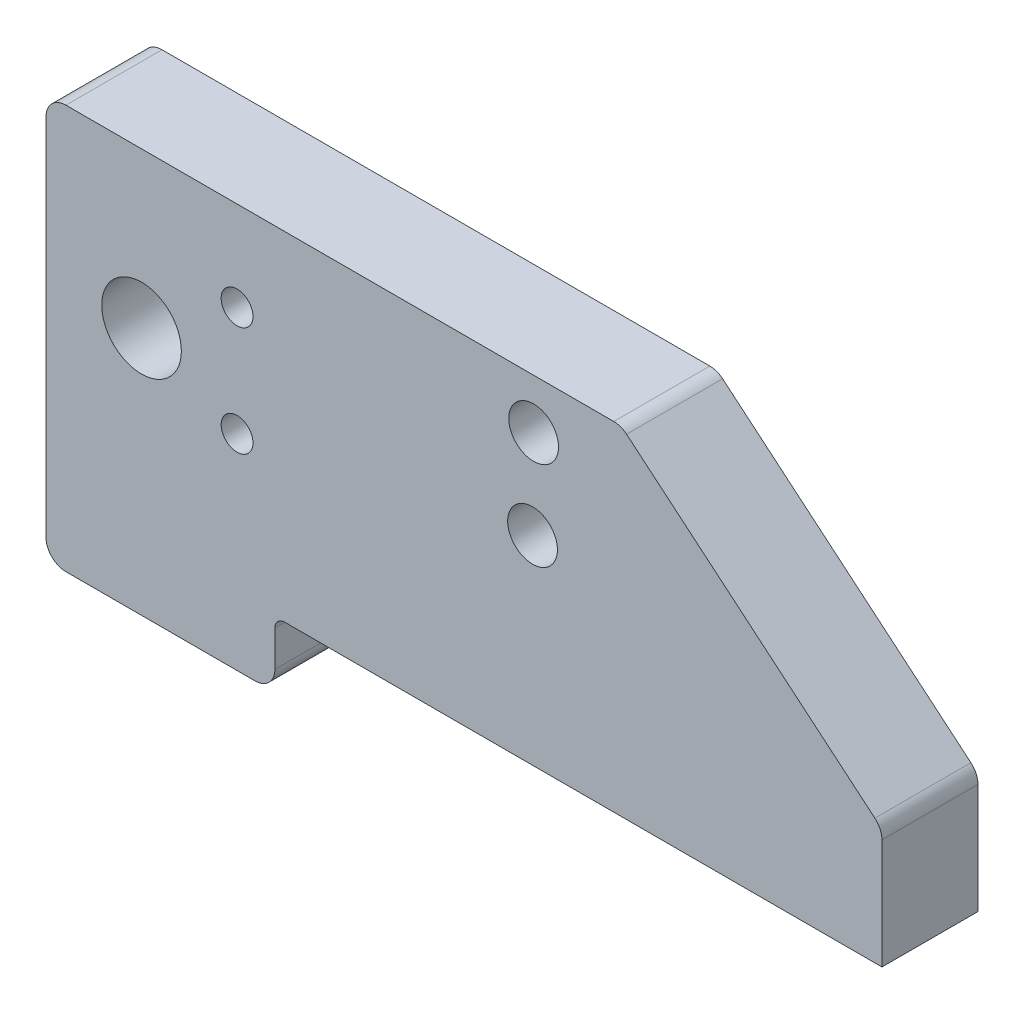
ISO-10303-21;
HEADER;
FILE_DESCRIPTION(('STEP AP214'),'2;1');
FILE_NAME('part.step','',(''),(''),'','','');
FILE_SCHEMA(('AUTOMOTIVE_DESIGN { 1 0 10303 214 1 1 1 1 }'));
ENDSEC;
DATA;
#1=APPLICATION_CONTEXT('core data for automotive mechanical design processes');
#2=APPLICATION_PROTOCOL_DEFINITION('international standard','automotive_design',2000,#1);
#3=PRODUCT_CONTEXT('',#1,'mechanical');
#4=PRODUCT('Part','Part','',(#3));
#5=PRODUCT_RELATED_PRODUCT_CATEGORY('part','',(#4));
#6=PRODUCT_DEFINITION_FORMATION('','',#4);
#7=PRODUCT_DEFINITION_CONTEXT('part definition',#1,'design');
#8=PRODUCT_DEFINITION('design','',#6,#7);
#9=PRODUCT_DEFINITION_SHAPE('','',#8);
#10=(LENGTH_UNIT() NAMED_UNIT(*) SI_UNIT(.MILLI.,.METRE.));
#11=(NAMED_UNIT(*) PLANE_ANGLE_UNIT() SI_UNIT($,.RADIAN.));
#12=(NAMED_UNIT(*) SI_UNIT($,.STERADIAN.) SOLID_ANGLE_UNIT());
#13=UNCERTAINTY_MEASURE_WITH_UNIT(LENGTH_MEASURE(1.E-05),#10,'distance_accuracy_value','');
#14=(GEOMETRIC_REPRESENTATION_CONTEXT(3) GLOBAL_UNCERTAINTY_ASSIGNED_CONTEXT((#13)) GLOBAL_UNIT_ASSIGNED_CONTEXT((#10,
#11,#12)) REPRESENTATION_CONTEXT('',''));
#15=CARTESIAN_POINT('',(0.,0.,0.));
#16=DIRECTION('',(0.,0.,1.));
#17=DIRECTION('',(1.,0.,0.));
#18=AXIS2_PLACEMENT_3D('',#15,#16,#17);
#19=CARTESIAN_POINT('',(0.,0.,4.826));
#20=DIRECTION('',(0.,-1.,0.));
#21=DIRECTION('',(0.,0.,-1.));
#22=AXIS2_PLACEMENT_3D('',#19,#20,#21);
#23=PLANE('',#22);
#24=CARTESIAN_POINT('',(-1.89071048146365,0.,2.413));
#25=DIRECTION('',(0.,-1.,0.));
#26=DIRECTION('',(0.,0.,-1.));
#27=AXIS2_PLACEMENT_3D('',#24,#25,#26);
#28=CIRCLE('',#27,1.24999999999999);
#29=CARTESIAN_POINT('',(-1.89071048146365,0.,1.16300000000001));
#30=VERTEX_POINT('',#29);
#31=EDGE_CURVE('E149',#30,#30,#28,.T.);
#32=ORIENTED_EDGE('',*,*,#31,.F.);
#33=EDGE_LOOP('',(#32));
#34=FACE_BOUND('',#33,.T.);
#35=CARTESIAN_POINT('',(10.1092895185364,0.,2.413));
#36=DIRECTION('',(0.,-1.,0.));
#37=DIRECTION('',(0.,0.,-1.));
#38=AXIS2_PLACEMENT_3D('',#35,#36,#37);
#39=CIRCLE('',#38,1.24999999999999);
#40=CARTESIAN_POINT('',(10.1092895185364,0.,1.16300000000001));
#41=VERTEX_POINT('',#40);
#42=EDGE_CURVE('E148',#41,#41,#39,.T.);
#43=ORIENTED_EDGE('',*,*,#42,.F.);
#44=EDGE_LOOP('',(#43));
#45=FACE_BOUND('',#44,.T.);
#46=DIRECTION('',(-1.,0.,0.));
#47=VECTOR('',#46,1.);
#48=CARTESIAN_POINT('',(0.,0.,4.826));
#49=LINE('',#48,#47);
#50=CARTESIAN_POINT('',(13.1092895185364,0.,4.826));
#51=VERTEX_POINT('',#50);
#52=CARTESIAN_POINT('',(-16.8907104814636,0.,4.826));
#53=VERTEX_POINT('',#52);
#54=EDGE_CURVE('E168',#51,#53,#49,.T.);
#55=ORIENTED_EDGE('',*,*,#54,.T.);
#56=DIRECTION('',(0.,0.,-1.));
#57=VECTOR('',#56,1.);
#58=CARTESIAN_POINT('',(-16.8907104814636,0.,0.));
#59=LINE('',#58,#57);
#60=CARTESIAN_POINT('',(-16.8907104814636,0.,0.));
#61=VERTEX_POINT('',#60);
#62=EDGE_CURVE('E237',#53,#61,#59,.T.);
#63=ORIENTED_EDGE('',*,*,#62,.T.);
#64=DIRECTION('',(-1.,0.,0.));
#65=VECTOR('',#64,1.);
#66=CARTESIAN_POINT('',(0.,0.,0.));
#67=LINE('',#66,#65);
#68=CARTESIAN_POINT('',(13.1092895185364,0.,0.));
#69=VERTEX_POINT('',#68);
#70=EDGE_CURVE('E167',#69,#61,#67,.T.);
#71=ORIENTED_EDGE('',*,*,#70,.F.);
#72=DIRECTION('',(0.,0.,-1.));
#73=VECTOR('',#72,1.);
#74=CARTESIAN_POINT('',(13.1092895185364,0.,4.826));
#75=LINE('',#74,#73);
#76=EDGE_CURVE('E180',#51,#69,#75,.T.);
#77=ORIENTED_EDGE('',*,*,#76,.F.);
#78=EDGE_LOOP('',(#55,#63,#71,#77));
#79=FACE_BOUND('',#78,.T.);
#80=ADVANCED_FACE('F41',(#34,#45,#79),#23,.T.);
#81=CARTESIAN_POINT('',(13.1092895185364,0.,4.826));
#82=DIRECTION('',(1.,0.,0.));
#83=DIRECTION('',(0.,0.,-1.));
#84=AXIS2_PLACEMENT_3D('',#81,#82,#83);
#85=PLANE('',#84);
#86=DIRECTION('',(0.,-1.,0.));
#87=VECTOR('',#86,1.);
#88=CARTESIAN_POINT('',(13.1092895185364,0.,0.));
#89=LINE('',#88,#87);
#90=CARTESIAN_POINT('',(13.1092895185364,5.533692341845,0.));
#91=VERTEX_POINT('',#90);
#92=EDGE_CURVE('E182',#91,#69,#89,.T.);
#93=ORIENTED_EDGE('',*,*,#92,.F.);
#94=DIRECTION('',(0.,0.,-1.));
#95=VECTOR('',#94,1.);
#96=CARTESIAN_POINT('',(13.1092895185364,5.533692341845,4.826));
#97=LINE('',#96,#95);
#98=CARTESIAN_POINT('',(13.1092895185364,5.533692341845,4.826));
#99=VERTEX_POINT('',#98);
#100=EDGE_CURVE('E206',#91,#99,#97,.F.);
#101=ORIENTED_EDGE('',*,*,#100,.T.);
#102=DIRECTION('',(0.,-1.,0.));
#103=VECTOR('',#102,1.);
#104=CARTESIAN_POINT('',(13.1092895185364,0.,4.826));
#105=LINE('',#104,#103);
#106=EDGE_CURVE('E171',#99,#51,#105,.T.);
#107=ORIENTED_EDGE('',*,*,#106,.T.);
#108=ORIENTED_EDGE('',*,*,#76,.T.);
#109=EDGE_LOOP('',(#93,#101,#107,#108));
#110=FACE_BOUND('',#109,.T.);
#111=ADVANCED_FACE('F252',(#110),#85,.T.);
#112=CARTESIAN_POINT('',(8.37086590060376,9.97600951016893,4.826));
#113=DIRECTION('',(0.642787609686538,0.766044443118979,0.));
#114=DIRECTION('',(-0.766044443118979,0.642787609686538,0.));
#115=AXIS2_PLACEMENT_3D('',#112,#113,#114);
#116=PLANE('',#115);
#117=DIRECTION('',(0.766044443118979,-0.642787609686538,0.));
#118=VECTOR('',#117,1.);
#119=CARTESIAN_POINT('',(8.37086590060376,9.97600951016893,4.826));
#120=LINE('',#119,#118);
#121=CARTESIAN_POINT('',(0.278817375420336,16.766044443119,4.826));
#122=VERTEX_POINT('',#121);
#123=CARTESIAN_POINT('',(12.7520771282229,6.29973678496398,4.826));
#124=VERTEX_POINT('',#123);
#125=EDGE_CURVE('E174',#122,#124,#120,.T.);
#126=ORIENTED_EDGE('',*,*,#125,.T.);
#127=DIRECTION('',(0.,0.,-1.));
#128=VECTOR('',#127,1.);
#129=CARTESIAN_POINT('',(12.7520771282229,6.29973678496398,4.826));
#130=LINE('',#129,#128);
#131=CARTESIAN_POINT('',(12.7520771282229,6.29973678496398,0.));
#132=VERTEX_POINT('',#131);
#133=EDGE_CURVE('E193',#124,#132,#130,.T.);
#134=ORIENTED_EDGE('',*,*,#133,.T.);
#135=DIRECTION('',(0.766044443118979,-0.642787609686538,0.));
#136=VECTOR('',#135,1.);
#137=CARTESIAN_POINT('',(8.37086590060376,9.97600951016893,0.));
#138=LINE('',#137,#136);
#139=CARTESIAN_POINT('',(0.278817375420336,16.766044443119,0.));
#140=VERTEX_POINT('',#139);
#141=EDGE_CURVE('E184',#140,#132,#138,.T.);
#142=ORIENTED_EDGE('',*,*,#141,.F.);
#143=DIRECTION('',(0.,0.,-1.));
#144=VECTOR('',#143,1.);
#145=CARTESIAN_POINT('',(0.278817375420336,16.766044443119,4.826));
#146=LINE('',#145,#144);
#147=EDGE_CURVE('E191',#140,#122,#146,.F.);
#148=ORIENTED_EDGE('',*,*,#147,.T.);
#149=EDGE_LOOP('',(#126,#134,#142,#148));
#150=FACE_BOUND('',#149,.T.);
#151=ADVANCED_FACE('F273',(#150),#116,.T.);
#152=CARTESIAN_POINT('',(0.,17.,4.826));
#153=DIRECTION('',(0.,-1.,0.));
#154=DIRECTION('',(0.,0.,-1.));
#155=AXIS2_PLACEMENT_3D('',#152,#153,#154);
#156=PLANE('',#155);
#157=DIRECTION('',(-1.,0.,0.));
#158=VECTOR('',#157,1.);
#159=CARTESIAN_POINT('',(0.,17.,4.826));
#160=LINE('',#159,#158);
#161=CARTESIAN_POINT('',(-0.363970234266202,17.,4.826));
#162=VERTEX_POINT('',#161);
#163=CARTESIAN_POINT('',(-27.8907104814636,17.,4.826));
#164=VERTEX_POINT('',#163);
#165=EDGE_CURVE('E177',#162,#164,#160,.T.);
#166=ORIENTED_EDGE('',*,*,#165,.F.);
#167=DIRECTION('',(0.,0.,-1.));
#168=VECTOR('',#167,1.);
#169=CARTESIAN_POINT('',(-0.363970234266202,17.,0.));
#170=LINE('',#169,#168);
#171=CARTESIAN_POINT('',(-0.363970234266202,17.,0.));
#172=VERTEX_POINT('',#171);
#173=EDGE_CURVE('E221',#162,#172,#170,.T.);
#174=ORIENTED_EDGE('',*,*,#173,.T.);
#175=DIRECTION('',(-1.,0.,0.));
#176=VECTOR('',#175,1.);
#177=CARTESIAN_POINT('',(0.,17.,0.));
#178=LINE('',#177,#176);
#179=CARTESIAN_POINT('',(-27.8907104814636,17.,0.));
#180=VERTEX_POINT('',#179);
#181=EDGE_CURVE('E172',#172,#180,#178,.T.);
#182=ORIENTED_EDGE('',*,*,#181,.T.);
#183=DIRECTION('',(0.,0.,-1.));
#184=VECTOR('',#183,1.);
#185=CARTESIAN_POINT('',(-27.8907104814636,17.,4.826));
#186=LINE('',#185,#184);
#187=EDGE_CURVE('E219',#180,#164,#186,.F.);
#188=ORIENTED_EDGE('',*,*,#187,.T.);
#189=EDGE_LOOP('',(#166,#174,#182,#188));
#190=FACE_BOUND('',#189,.T.);
#191=ADVANCED_FACE('F355',(#190),#156,.F.);
#192=CARTESIAN_POINT('',(0.,0.,4.826));
#193=DIRECTION('',(0.,0.,1.));
#194=DIRECTION('',(1.,0.,0.));
#195=AXIS2_PLACEMENT_3D('',#192,#193,#194);
#196=PLANE('',#195);
#197=CARTESIAN_POINT('',(-19.2907104814636,12.5,4.826));
#198=DIRECTION('',(0.,0.,1.));
#199=DIRECTION('',(1.,0.,0.));
#200=AXIS2_PLACEMENT_3D('',#197,#198,#199);
#201=CIRCLE('',#200,0.800000000000012);
#202=CARTESIAN_POINT('',(-18.4907104814636,12.5,4.826));
#203=VERTEX_POINT('',#202);
#204=EDGE_CURVE('E348',#203,#203,#201,.T.);
#205=ORIENTED_EDGE('',*,*,#204,.F.);
#206=EDGE_LOOP('',(#205));
#207=FACE_BOUND('',#206,.T.);
#208=CARTESIAN_POINT('',(-19.2907104814636,7.,4.826));
#209=DIRECTION('',(0.,0.,1.));
#210=DIRECTION('',(1.,0.,0.));
#211=AXIS2_PLACEMENT_3D('',#208,#209,#210);
#212=CIRCLE('',#211,0.800000000000012);
#213=CARTESIAN_POINT('',(-18.4907104814636,7.,4.826));
#214=VERTEX_POINT('',#213);
#215=EDGE_CURVE('E342',#214,#214,#212,.T.);
#216=ORIENTED_EDGE('',*,*,#215,.F.);
#217=EDGE_LOOP('',(#216));
#218=FACE_BOUND('',#217,.T.);
#219=CARTESIAN_POINT('',(-4.39071048146365,14.5,4.826));
#220=DIRECTION('',(0.,0.,1.));
#221=DIRECTION('',(1.,0.,0.));
#222=AXIS2_PLACEMENT_3D('',#219,#220,#221);
#223=CIRCLE('',#222,1.25);
#224=CARTESIAN_POINT('',(-3.14071048146365,14.5,4.826));
#225=VERTEX_POINT('',#224);
#226=EDGE_CURVE('E336',#225,#225,#223,.T.);
#227=ORIENTED_EDGE('',*,*,#226,.F.);
#228=EDGE_LOOP('',(#227));
#229=FACE_BOUND('',#228,.T.);
#230=CARTESIAN_POINT('',(-4.44535524073182,10.,4.826));
#231=DIRECTION('',(0.,0.,1.));
#232=DIRECTION('',(1.,0.,0.));
#233=AXIS2_PLACEMENT_3D('',#230,#231,#232);
#234=CIRCLE('',#233,1.24999999999999);
#235=CARTESIAN_POINT('',(-3.19535524073184,10.,4.826));
#236=VERTEX_POINT('',#235);
#237=EDGE_CURVE('E161',#236,#236,#234,.T.);
#238=ORIENTED_EDGE('',*,*,#237,.F.);
#239=EDGE_LOOP('',(#238));
#240=FACE_BOUND('',#239,.T.);
#241=ORIENTED_EDGE('',*,*,#106,.F.);
#242=CARTESIAN_POINT('',(12.1092895185364,5.533692341845,4.826));
#243=DIRECTION('',(0.,0.,1.));
#244=DIRECTION('',(1.,0.,0.));
#245=AXIS2_PLACEMENT_3D('',#242,#243,#244);
#246=CIRCLE('',#245,1.);
#247=EDGE_CURVE('E217',#99,#124,#246,.T.);
#248=ORIENTED_EDGE('',*,*,#247,.T.);
#249=ORIENTED_EDGE('',*,*,#125,.F.);
#250=CARTESIAN_POINT('',(-0.363970234266202,16.,4.826));
#251=DIRECTION('',(0.,0.,1.));
#252=DIRECTION('',(1.,0.,0.));
#253=AXIS2_PLACEMENT_3D('',#250,#251,#252);
#254=CIRCLE('',#253,1.);
#255=EDGE_CURVE('E215',#122,#162,#254,.T.);
#256=ORIENTED_EDGE('',*,*,#255,.T.);
#257=ORIENTED_EDGE('',*,*,#165,.T.);
#258=CARTESIAN_POINT('',(-27.8907104814636,16.,4.826));
#259=DIRECTION('',(0.,0.,1.));
#260=DIRECTION('',(1.,0.,0.));
#261=AXIS2_PLACEMENT_3D('',#258,#259,#260);
#262=CIRCLE('',#261,1.);
#263=CARTESIAN_POINT('',(-28.8907104814636,16.,4.826));
#264=VERTEX_POINT('',#263);
#265=EDGE_CURVE('E213',#164,#264,#262,.T.);
#266=ORIENTED_EDGE('',*,*,#265,.T.);
#267=DIRECTION('',(0.,1.,0.));
#268=VECTOR('',#267,1.);
#269=CARTESIAN_POINT('',(-28.8907104814636,0.,4.826));
#270=LINE('',#269,#268);
#271=CARTESIAN_POINT('',(-28.8907104814636,-2.3,4.826));
#272=VERTEX_POINT('',#271);
#273=EDGE_CURVE('E312',#272,#264,#270,.T.);
#274=ORIENTED_EDGE('',*,*,#273,.F.);
#275=CARTESIAN_POINT('',(-27.8907104814636,-2.3,4.826));
#276=DIRECTION('',(0.,0.,1.));
#277=DIRECTION('',(1.,0.,0.));
#278=AXIS2_PLACEMENT_3D('',#275,#276,#277);
#279=CIRCLE('',#278,1.);
#280=CARTESIAN_POINT('',(-27.8907104814636,-3.3,4.826));
#281=VERTEX_POINT('',#280);
#282=EDGE_CURVE('E208',#272,#281,#279,.T.);
#283=ORIENTED_EDGE('',*,*,#282,.T.);
#284=DIRECTION('',(-1.,0.,0.));
#285=VECTOR('',#284,1.);
#286=CARTESIAN_POINT('',(0.,-3.3,4.826));
#287=LINE('',#286,#285);
#288=CARTESIAN_POINT('',(-18.3907104814636,-3.3,4.826));
#289=VERTEX_POINT('',#288);
#290=EDGE_CURVE('E309',#289,#281,#287,.T.);
#291=ORIENTED_EDGE('',*,*,#290,.F.);
#292=CARTESIAN_POINT('',(-18.3907104814636,-2.3,4.826));
#293=DIRECTION('',(0.,0.,1.));
#294=DIRECTION('',(1.,0.,0.));
#295=AXIS2_PLACEMENT_3D('',#292,#293,#294);
#296=CIRCLE('',#295,1.);
#297=CARTESIAN_POINT('',(-17.3907104814636,-2.3,4.826));
#298=VERTEX_POINT('',#297);
#299=EDGE_CURVE('E210',#289,#298,#296,.T.);
#300=ORIENTED_EDGE('',*,*,#299,.T.);
#301=DIRECTION('',(0.,-1.,0.));
#302=VECTOR('',#301,1.);
#303=CARTESIAN_POINT('',(-17.3907104814636,0.,4.826));
#304=LINE('',#303,#302);
#305=CARTESIAN_POINT('',(-17.3907104814636,-0.499999999999999,4.826));
#306=VERTEX_POINT('',#305);
#307=EDGE_CURVE('E258',#306,#298,#304,.T.);
#308=ORIENTED_EDGE('',*,*,#307,.F.);
#309=CARTESIAN_POINT('',(-16.8907104814636,-0.5,4.826));
#310=DIRECTION('',(0.,0.,1.));
#311=DIRECTION('',(1.,0.,0.));
#312=AXIS2_PLACEMENT_3D('',#309,#310,#311);
#313=CIRCLE('',#312,0.5);
#314=EDGE_CURVE('E11',#306,#53,#313,.F.);
#315=ORIENTED_EDGE('',*,*,#314,.T.);
#316=ORIENTED_EDGE('',*,*,#54,.F.);
#317=EDGE_LOOP('',(#241,#248,#249,#256,#257,#266,#274,#283,#291,#300,#308,#315,#316));
#318=FACE_BOUND('',#317,.T.);
#319=CARTESIAN_POINT('',(-24.0907104814636,9.2,4.826));
#320=DIRECTION('',(0.,0.,1.));
#321=DIRECTION('',(1.,0.,0.));
#322=AXIS2_PLACEMENT_3D('',#319,#320,#321);
#323=CIRCLE('',#322,2.);
#324=CARTESIAN_POINT('',(-22.0907104814636,9.2,4.826));
#325=VERTEX_POINT('',#324);
#326=EDGE_CURVE('E319',#325,#325,#323,.T.);
#327=ORIENTED_EDGE('',*,*,#326,.F.);
#328=EDGE_LOOP('',(#327));
#329=FACE_BOUND('',#328,.T.);
#330=ADVANCED_FACE('F255',(#207,#218,#229,#240,#318,#329),#196,.T.);
#331=CARTESIAN_POINT('',(0.,0.,0.));
#332=DIRECTION('',(0.,0.,1.));
#333=DIRECTION('',(1.,0.,0.));
#334=AXIS2_PLACEMENT_3D('',#331,#332,#333);
#335=PLANE('',#334);
#336=CARTESIAN_POINT('',(-19.2907104814636,12.5,0.));
#337=DIRECTION('',(0.,0.,1.));
#338=DIRECTION('',(1.,0.,0.));
#339=AXIS2_PLACEMENT_3D('',#336,#337,#338);
#340=CIRCLE('',#339,0.800000000000012);
#341=CARTESIAN_POINT('',(-18.4907104814636,12.5,0.));
#342=VERTEX_POINT('',#341);
#343=EDGE_CURVE('E345',#342,#342,#340,.T.);
#344=ORIENTED_EDGE('',*,*,#343,.T.);
#345=EDGE_LOOP('',(#344));
#346=FACE_BOUND('',#345,.T.);
#347=CARTESIAN_POINT('',(-19.2907104814636,7.,0.));
#348=DIRECTION('',(0.,0.,1.));
#349=DIRECTION('',(1.,0.,0.));
#350=AXIS2_PLACEMENT_3D('',#347,#348,#349);
#351=CIRCLE('',#350,0.800000000000012);
#352=CARTESIAN_POINT('',(-18.4907104814636,7.,0.));
#353=VERTEX_POINT('',#352);
#354=EDGE_CURVE('E339',#353,#353,#351,.T.);
#355=ORIENTED_EDGE('',*,*,#354,.T.);
#356=EDGE_LOOP('',(#355));
#357=FACE_BOUND('',#356,.T.);
#358=CARTESIAN_POINT('',(-4.39071048146365,14.5,0.));
#359=DIRECTION('',(0.,0.,1.));
#360=DIRECTION('',(1.,0.,0.));
#361=AXIS2_PLACEMENT_3D('',#358,#359,#360);
#362=CIRCLE('',#361,1.25);
#363=CARTESIAN_POINT('',(-3.14071048146365,14.5,0.));
#364=VERTEX_POINT('',#363);
#365=EDGE_CURVE('E321',#364,#364,#362,.T.);
#366=ORIENTED_EDGE('',*,*,#365,.T.);
#367=EDGE_LOOP('',(#366));
#368=FACE_BOUND('',#367,.T.);
#369=CARTESIAN_POINT('',(-4.44535524073182,10.,0.));
#370=DIRECTION('',(0.,0.,1.));
#371=DIRECTION('',(1.,0.,0.));
#372=AXIS2_PLACEMENT_3D('',#369,#370,#371);
#373=CIRCLE('',#372,1.25);
#374=CARTESIAN_POINT('',(-3.19535524073183,10.,0.));
#375=VERTEX_POINT('',#374);
#376=EDGE_CURVE('E164',#375,#375,#373,.T.);
#377=ORIENTED_EDGE('',*,*,#376,.T.);
#378=EDGE_LOOP('',(#377));
#379=FACE_BOUND('',#378,.T.);
#380=ORIENTED_EDGE('',*,*,#141,.T.);
#381=CARTESIAN_POINT('',(12.1092895185364,5.533692341845,0.));
#382=DIRECTION('',(0.,0.,1.));
#383=DIRECTION('',(1.,0.,0.));
#384=AXIS2_PLACEMENT_3D('',#381,#382,#383);
#385=CIRCLE('',#384,1.);
#386=EDGE_CURVE('E204',#132,#91,#385,.F.);
#387=ORIENTED_EDGE('',*,*,#386,.T.);
#388=ORIENTED_EDGE('',*,*,#92,.T.);
#389=ORIENTED_EDGE('',*,*,#70,.T.);
#390=CARTESIAN_POINT('',(-16.8907104814636,-0.5,0.));
#391=DIRECTION('',(0.,0.,1.));
#392=DIRECTION('',(1.,0.,0.));
#393=AXIS2_PLACEMENT_3D('',#390,#391,#392);
#394=CIRCLE('',#393,0.5);
#395=CARTESIAN_POINT('',(-17.3907104814636,-0.499999999999999,0.));
#396=VERTEX_POINT('',#395);
#397=EDGE_CURVE('E49',#61,#396,#394,.T.);
#398=ORIENTED_EDGE('',*,*,#397,.T.);
#399=DIRECTION('',(0.,-1.,0.));
#400=VECTOR('',#399,1.);
#401=CARTESIAN_POINT('',(-17.3907104814636,0.,0.));
#402=LINE('',#401,#400);
#403=CARTESIAN_POINT('',(-17.3907104814636,-2.3,0.));
#404=VERTEX_POINT('',#403);
#405=EDGE_CURVE('E328',#396,#404,#402,.T.);
#406=ORIENTED_EDGE('',*,*,#405,.T.);
#407=CARTESIAN_POINT('',(-18.3907104814636,-2.3,0.));
#408=DIRECTION('',(0.,0.,1.));
#409=DIRECTION('',(1.,0.,0.));
#410=AXIS2_PLACEMENT_3D('',#407,#408,#409);
#411=CIRCLE('',#410,1.);
#412=CARTESIAN_POINT('',(-18.3907104814636,-3.3,0.));
#413=VERTEX_POINT('',#412);
#414=EDGE_CURVE('E198',#404,#413,#411,.F.);
#415=ORIENTED_EDGE('',*,*,#414,.T.);
#416=DIRECTION('',(-1.,0.,0.));
#417=VECTOR('',#416,1.);
#418=CARTESIAN_POINT('',(0.,-3.3,0.));
#419=LINE('',#418,#417);
#420=CARTESIAN_POINT('',(-27.8907104814636,-3.3,0.));
#421=VERTEX_POINT('',#420);
#422=EDGE_CURVE('E331',#413,#421,#419,.T.);
#423=ORIENTED_EDGE('',*,*,#422,.T.);
#424=CARTESIAN_POINT('',(-27.8907104814636,-2.3,0.));
#425=DIRECTION('',(0.,0.,1.));
#426=DIRECTION('',(1.,0.,0.));
#427=AXIS2_PLACEMENT_3D('',#424,#425,#426);
#428=CIRCLE('',#427,1.);
#429=CARTESIAN_POINT('',(-28.8907104814636,-2.3,0.));
#430=VERTEX_POINT('',#429);
#431=EDGE_CURVE('E196',#421,#430,#428,.F.);
#432=ORIENTED_EDGE('',*,*,#431,.T.);
#433=DIRECTION('',(0.,1.,0.));
#434=VECTOR('',#433,1.);
#435=CARTESIAN_POINT('',(-28.8907104814636,0.,0.));
#436=LINE('',#435,#434);
#437=CARTESIAN_POINT('',(-28.8907104814636,16.,0.));
#438=VERTEX_POINT('',#437);
#439=EDGE_CURVE('E155',#430,#438,#436,.T.);
#440=ORIENTED_EDGE('',*,*,#439,.T.);
#441=CARTESIAN_POINT('',(-27.8907104814636,16.,0.));
#442=DIRECTION('',(0.,0.,1.));
#443=DIRECTION('',(1.,0.,0.));
#444=AXIS2_PLACEMENT_3D('',#441,#442,#443);
#445=CIRCLE('',#444,1.);
#446=EDGE_CURVE('E200',#438,#180,#445,.F.);
#447=ORIENTED_EDGE('',*,*,#446,.T.);
#448=ORIENTED_EDGE('',*,*,#181,.F.);
#449=CARTESIAN_POINT('',(-0.363970234266202,16.,0.));
#450=DIRECTION('',(0.,0.,1.));
#451=DIRECTION('',(1.,0.,0.));
#452=AXIS2_PLACEMENT_3D('',#449,#450,#451);
#453=CIRCLE('',#452,1.);
#454=EDGE_CURVE('E202',#172,#140,#453,.F.);
#455=ORIENTED_EDGE('',*,*,#454,.T.);
#456=EDGE_LOOP('',(#380,#387,#388,#389,#398,#406,#415,#423,#432,#440,#447,#448,#455));
#457=FACE_BOUND('',#456,.T.);
#458=CARTESIAN_POINT('',(-24.0907104814636,9.2,0.));
#459=DIRECTION('',(0.,0.,1.));
#460=DIRECTION('',(1.,0.,0.));
#461=AXIS2_PLACEMENT_3D('',#458,#459,#460);
#462=CIRCLE('',#461,2.);
#463=CARTESIAN_POINT('',(-22.0907104814636,9.2,0.));
#464=VERTEX_POINT('',#463);
#465=EDGE_CURVE('E325',#464,#464,#462,.T.);
#466=ORIENTED_EDGE('',*,*,#465,.T.);
#467=EDGE_LOOP('',(#466));
#468=FACE_BOUND('',#467,.T.);
#469=ADVANCED_FACE('F247',(#346,#357,#368,#379,#457,#468),#335,.F.);
#470=CARTESIAN_POINT('',(-4.44535524073182,10.,4.826));
#471=DIRECTION('',(0.,0.,1.));
#472=DIRECTION('',(1.,0.,0.));
#473=AXIS2_PLACEMENT_3D('',#470,#471,#472);
#474=CYLINDRICAL_SURFACE('',#473,1.24999999999999);
#475=ORIENTED_EDGE('',*,*,#376,.F.);
#476=EDGE_LOOP('',(#475));
#477=FACE_BOUND('',#476,.T.);
#478=ORIENTED_EDGE('',*,*,#237,.T.);
#479=EDGE_LOOP('',(#478));
#480=FACE_BOUND('',#479,.T.);
#481=ADVANCED_FACE('F363',(#477,#480),#474,.F.);
#482=CARTESIAN_POINT('',(10.1092895185364,5.,2.413));
#483=DIRECTION('',(0.,-1.,0.));
#484=DIRECTION('',(0.,0.,-1.));
#485=AXIS2_PLACEMENT_3D('',#482,#483,#484);
#486=CONICAL_SURFACE('',#485,1.25,1.02974425867665);
#487=CARTESIAN_POINT('',(10.1092895185364,5.75107577378445,2.413));
#488=VERTEX_POINT('',#487);
#489=VERTEX_LOOP('',#488);
#490=FACE_BOUND('',#489,.T.);
#491=CARTESIAN_POINT('',(10.1092895185364,5.,2.413));
#492=DIRECTION('',(0.,-1.,0.));
#493=DIRECTION('',(0.,0.,-1.));
#494=AXIS2_PLACEMENT_3D('',#491,#492,#493);
#495=CIRCLE('',#494,1.25);
#496=CARTESIAN_POINT('',(10.1092895185364,5.,1.163));
#497=VERTEX_POINT('',#496);
#498=EDGE_CURVE('E152',#497,#497,#495,.T.);
#499=ORIENTED_EDGE('',*,*,#498,.T.);
#500=EDGE_LOOP('',(#499));
#501=FACE_BOUND('',#500,.T.);
#502=ADVANCED_FACE('F365',(#490,#501),#486,.F.);
#503=CARTESIAN_POINT('',(10.1092895185364,0.,2.413));
#504=DIRECTION('',(0.,-1.,0.));
#505=DIRECTION('',(0.,0.,-1.));
#506=AXIS2_PLACEMENT_3D('',#503,#504,#505);
#507=CYLINDRICAL_SURFACE('',#506,1.24999999999999);
#508=ORIENTED_EDGE('',*,*,#498,.F.);
#509=EDGE_LOOP('',(#508));
#510=FACE_BOUND('',#509,.T.);
#511=ORIENTED_EDGE('',*,*,#42,.T.);
#512=EDGE_LOOP('',(#511));
#513=FACE_BOUND('',#512,.T.);
#514=ADVANCED_FACE('F142',(#510,#513),#507,.F.);
#515=CARTESIAN_POINT('',(-1.89071048146365,5.,2.413));
#516=DIRECTION('',(0.,-1.,0.));
#517=DIRECTION('',(0.,0.,-1.));
#518=AXIS2_PLACEMENT_3D('',#515,#516,#517);
#519=CONICAL_SURFACE('',#518,1.25,1.02974425867665);
#520=CARTESIAN_POINT('',(-1.89071048146365,5.75107577378445,2.413));
#521=VERTEX_POINT('',#520);
#522=VERTEX_LOOP('',#521);
#523=FACE_BOUND('',#522,.T.);
#524=CARTESIAN_POINT('',(-1.89071048146365,5.,2.413));
#525=DIRECTION('',(0.,-1.,0.));
#526=DIRECTION('',(0.,0.,-1.));
#527=AXIS2_PLACEMENT_3D('',#524,#525,#526);
#528=CIRCLE('',#527,1.25);
#529=CARTESIAN_POINT('',(-1.89071048146365,5.,1.163));
#530=VERTEX_POINT('',#529);
#531=EDGE_CURVE('E146',#530,#530,#528,.T.);
#532=ORIENTED_EDGE('',*,*,#531,.T.);
#533=EDGE_LOOP('',(#532));
#534=FACE_BOUND('',#533,.T.);
#535=ADVANCED_FACE('F138',(#523,#534),#519,.F.);
#536=CARTESIAN_POINT('',(-1.89071048146365,0.,2.413));
#537=DIRECTION('',(0.,-1.,0.));
#538=DIRECTION('',(0.,0.,-1.));
#539=AXIS2_PLACEMENT_3D('',#536,#537,#538);
#540=CYLINDRICAL_SURFACE('',#539,1.24999999999999);
#541=ORIENTED_EDGE('',*,*,#531,.F.);
#542=EDGE_LOOP('',(#541));
#543=FACE_BOUND('',#542,.T.);
#544=ORIENTED_EDGE('',*,*,#31,.T.);
#545=EDGE_LOOP('',(#544));
#546=FACE_BOUND('',#545,.T.);
#547=ADVANCED_FACE('F141',(#543,#546),#540,.F.);
#548=CARTESIAN_POINT('',(-28.8907104814636,0.,33.3231928442084));
#549=DIRECTION('',(-1.,0.,0.));
#550=DIRECTION('',(0.,-1.,0.));
#551=AXIS2_PLACEMENT_3D('',#548,#549,#550);
#552=PLANE('',#551);
#553=ORIENTED_EDGE('',*,*,#273,.T.);
#554=DIRECTION('',(0.,0.,-1.));
#555=VECTOR('',#554,1.);
#556=CARTESIAN_POINT('',(-28.8907104814636,16.,0.));
#557=LINE('',#556,#555);
#558=EDGE_CURVE('E226',#264,#438,#557,.T.);
#559=ORIENTED_EDGE('',*,*,#558,.T.);
#560=ORIENTED_EDGE('',*,*,#439,.F.);
#561=DIRECTION('',(0.,0.,-1.));
#562=VECTOR('',#561,1.);
#563=CARTESIAN_POINT('',(-28.8907104814636,-2.3,33.3231928442084));
#564=LINE('',#563,#562);
#565=EDGE_CURVE('E224',#430,#272,#564,.F.);
#566=ORIENTED_EDGE('',*,*,#565,.T.);
#567=EDGE_LOOP('',(#553,#559,#560,#566));
#568=FACE_BOUND('',#567,.T.);
#569=ADVANCED_FACE('F398',(#568),#552,.T.);
#570=CARTESIAN_POINT('',(0.,-3.3,33.3231928442084));
#571=DIRECTION('',(0.,-1.,0.));
#572=DIRECTION('',(1.,0.,0.));
#573=AXIS2_PLACEMENT_3D('',#570,#571,#572);
#574=PLANE('',#573);
#575=ORIENTED_EDGE('',*,*,#422,.F.);
#576=DIRECTION('',(0.,0.,-1.));
#577=VECTOR('',#576,1.);
#578=CARTESIAN_POINT('',(-18.3907104814636,-3.3,33.3231928442084));
#579=LINE('',#578,#577);
#580=EDGE_CURVE('E235',#413,#289,#579,.F.);
#581=ORIENTED_EDGE('',*,*,#580,.T.);
#582=ORIENTED_EDGE('',*,*,#290,.T.);
#583=DIRECTION('',(0.,0.,-1.));
#584=VECTOR('',#583,1.);
#585=CARTESIAN_POINT('',(-27.8907104814636,-3.3,33.3231928442084));
#586=LINE('',#585,#584);
#587=EDGE_CURVE('E232',#281,#421,#586,.T.);
#588=ORIENTED_EDGE('',*,*,#587,.T.);
#589=EDGE_LOOP('',(#575,#581,#582,#588));
#590=FACE_BOUND('',#589,.T.);
#591=ADVANCED_FACE('F315',(#590),#574,.T.);
#592=CARTESIAN_POINT('',(-17.3907104814636,0.,33.3231928442084));
#593=DIRECTION('',(1.,0.,0.));
#594=DIRECTION('',(0.,1.,0.));
#595=AXIS2_PLACEMENT_3D('',#592,#593,#594);
#596=PLANE('',#595);
#597=ORIENTED_EDGE('',*,*,#405,.F.);
#598=DIRECTION('',(0.,0.,-1.));
#599=VECTOR('',#598,1.);
#600=CARTESIAN_POINT('',(-17.3907104814636,-0.499999999999999,4.826));
#601=LINE('',#600,#599);
#602=EDGE_CURVE('E62',#396,#306,#601,.F.);
#603=ORIENTED_EDGE('',*,*,#602,.T.);
#604=ORIENTED_EDGE('',*,*,#307,.T.);
#605=DIRECTION('',(0.,0.,-1.));
#606=VECTOR('',#605,1.);
#607=CARTESIAN_POINT('',(-17.3907104814636,-2.3,33.3231928442084));
#608=LINE('',#607,#606);
#609=EDGE_CURVE('E229',#298,#404,#608,.T.);
#610=ORIENTED_EDGE('',*,*,#609,.T.);
#611=EDGE_LOOP('',(#597,#603,#604,#610));
#612=FACE_BOUND('',#611,.T.);
#613=ADVANCED_FACE('F405',(#612),#596,.T.);
#614=CARTESIAN_POINT('',(-24.0907104814636,9.2,33.3231928442084));
#615=DIRECTION('',(0.,0.,-1.));
#616=DIRECTION('',(-1.,0.,0.));
#617=AXIS2_PLACEMENT_3D('',#614,#615,#616);
#618=CYLINDRICAL_SURFACE('',#617,2.);
#619=ORIENTED_EDGE('',*,*,#465,.F.);
#620=EDGE_LOOP('',(#619));
#621=FACE_BOUND('',#620,.T.);
#622=ORIENTED_EDGE('',*,*,#326,.T.);
#623=EDGE_LOOP('',(#622));
#624=FACE_BOUND('',#623,.T.);
#625=ADVANCED_FACE('F433',(#621,#624),#618,.F.);
#626=CARTESIAN_POINT('',(-4.39071048146365,14.5,4.826));
#627=DIRECTION('',(0.,0.,1.));
#628=DIRECTION('',(1.,0.,0.));
#629=AXIS2_PLACEMENT_3D('',#626,#627,#628);
#630=CYLINDRICAL_SURFACE('',#629,1.25);
#631=ORIENTED_EDGE('',*,*,#365,.F.);
#632=EDGE_LOOP('',(#631));
#633=FACE_BOUND('',#632,.T.);
#634=ORIENTED_EDGE('',*,*,#226,.T.);
#635=EDGE_LOOP('',(#634));
#636=FACE_BOUND('',#635,.T.);
#637=ADVANCED_FACE('F283',(#633,#636),#630,.F.);
#638=CARTESIAN_POINT('',(12.1092895185364,5.533692341845,4.826));
#639=DIRECTION('',(0.,0.,-1.));
#640=DIRECTION('',(-1.,0.,0.));
#641=AXIS2_PLACEMENT_3D('',#638,#639,#640);
#642=CYLINDRICAL_SURFACE('',#641,1.);
#643=ORIENTED_EDGE('',*,*,#247,.F.);
#644=ORIENTED_EDGE('',*,*,#100,.F.);
#645=ORIENTED_EDGE('',*,*,#386,.F.);
#646=ORIENTED_EDGE('',*,*,#133,.F.);
#647=EDGE_LOOP('',(#643,#644,#645,#646));
#648=FACE_BOUND('',#647,.T.);
#649=ADVANCED_FACE('F279',(#648),#642,.T.);
#650=CARTESIAN_POINT('',(-0.363970234266202,16.,4.826));
#651=DIRECTION('',(0.,0.,1.));
#652=DIRECTION('',(1.,0.,0.));
#653=AXIS2_PLACEMENT_3D('',#650,#651,#652);
#654=CYLINDRICAL_SURFACE('',#653,1.);
#655=ORIENTED_EDGE('',*,*,#255,.F.);
#656=ORIENTED_EDGE('',*,*,#147,.F.);
#657=ORIENTED_EDGE('',*,*,#454,.F.);
#658=ORIENTED_EDGE('',*,*,#173,.F.);
#659=EDGE_LOOP('',(#655,#656,#657,#658));
#660=FACE_BOUND('',#659,.T.);
#661=ADVANCED_FACE('F282',(#660),#654,.T.);
#662=CARTESIAN_POINT('',(-27.8907104814636,16.,33.3231928442084));
#663=DIRECTION('',(0.,0.,1.));
#664=DIRECTION('',(1.,0.,0.));
#665=AXIS2_PLACEMENT_3D('',#662,#663,#664);
#666=CYLINDRICAL_SURFACE('',#665,1.);
#667=ORIENTED_EDGE('',*,*,#265,.F.);
#668=ORIENTED_EDGE('',*,*,#187,.F.);
#669=ORIENTED_EDGE('',*,*,#446,.F.);
#670=ORIENTED_EDGE('',*,*,#558,.F.);
#671=EDGE_LOOP('',(#667,#668,#669,#670));
#672=FACE_BOUND('',#671,.T.);
#673=ADVANCED_FACE('F287',(#672),#666,.T.);
#674=CARTESIAN_POINT('',(-18.3907104814636,-2.3,33.3231928442084));
#675=DIRECTION('',(0.,0.,-1.));
#676=DIRECTION('',(-1.,0.,0.));
#677=AXIS2_PLACEMENT_3D('',#674,#675,#676);
#678=CYLINDRICAL_SURFACE('',#677,1.);
#679=ORIENTED_EDGE('',*,*,#299,.F.);
#680=ORIENTED_EDGE('',*,*,#580,.F.);
#681=ORIENTED_EDGE('',*,*,#414,.F.);
#682=ORIENTED_EDGE('',*,*,#609,.F.);
#683=EDGE_LOOP('',(#679,#680,#681,#682));
#684=FACE_BOUND('',#683,.T.);
#685=ADVANCED_FACE('F291',(#684),#678,.T.);
#686=CARTESIAN_POINT('',(-27.8907104814636,-2.3,33.3231928442084));
#687=DIRECTION('',(0.,0.,-1.));
#688=DIRECTION('',(-1.,0.,0.));
#689=AXIS2_PLACEMENT_3D('',#686,#687,#688);
#690=CYLINDRICAL_SURFACE('',#689,1.);
#691=ORIENTED_EDGE('',*,*,#282,.F.);
#692=ORIENTED_EDGE('',*,*,#565,.F.);
#693=ORIENTED_EDGE('',*,*,#431,.F.);
#694=ORIENTED_EDGE('',*,*,#587,.F.);
#695=EDGE_LOOP('',(#691,#692,#693,#694));
#696=FACE_BOUND('',#695,.T.);
#697=ADVANCED_FACE('F294',(#696),#690,.T.);
#698=CARTESIAN_POINT('',(-19.2907104814636,7.,4.826));
#699=DIRECTION('',(0.,0.,1.));
#700=DIRECTION('',(1.,0.,0.));
#701=AXIS2_PLACEMENT_3D('',#698,#699,#700);
#702=CYLINDRICAL_SURFACE('',#701,0.800000000000012);
#703=ORIENTED_EDGE('',*,*,#354,.F.);
#704=EDGE_LOOP('',(#703));
#705=FACE_BOUND('',#704,.T.);
#706=ORIENTED_EDGE('',*,*,#215,.T.);
#707=EDGE_LOOP('',(#706));
#708=FACE_BOUND('',#707,.T.);
#709=ADVANCED_FACE('F264',(#705,#708),#702,.F.);
#710=CARTESIAN_POINT('',(-19.2907104814636,12.5,4.826));
#711=DIRECTION('',(0.,0.,1.));
#712=DIRECTION('',(1.,0.,0.));
#713=AXIS2_PLACEMENT_3D('',#710,#711,#712);
#714=CYLINDRICAL_SURFACE('',#713,0.800000000000012);
#715=ORIENTED_EDGE('',*,*,#343,.F.);
#716=EDGE_LOOP('',(#715));
#717=FACE_BOUND('',#716,.T.);
#718=ORIENTED_EDGE('',*,*,#204,.T.);
#719=EDGE_LOOP('',(#718));
#720=FACE_BOUND('',#719,.T.);
#721=ADVANCED_FACE('F260',(#717,#720),#714,.F.);
#722=CARTESIAN_POINT('',(-16.8907104814636,-0.5,4.826));
#723=DIRECTION('',(0.,0.,1.));
#724=DIRECTION('',(1.,0.,0.));
#725=AXIS2_PLACEMENT_3D('',#722,#723,#724);
#726=CYLINDRICAL_SURFACE('',#725,0.5);
#727=ORIENTED_EDGE('',*,*,#314,.F.);
#728=ORIENTED_EDGE('',*,*,#602,.F.);
#729=ORIENTED_EDGE('',*,*,#397,.F.);
#730=ORIENTED_EDGE('',*,*,#62,.F.);
#731=EDGE_LOOP('',(#727,#728,#729,#730));
#732=FACE_BOUND('',#731,.T.);
#733=ADVANCED_FACE('F43',(#732),#726,.F.);
#734=CLOSED_SHELL('',(#80,#111,#151,#191,#330,#469,#481,#502,#514,#535,#547,#569,#591,#613,#625,
#637,#649,#661,#673,#685,#697,#709,#721,#733));
#735=MANIFOLD_SOLID_BREP('B2',#734);
#736=ADVANCED_BREP_SHAPE_REPRESENTATION('',(#18,#735),#14);
#737=SHAPE_DEFINITION_REPRESENTATION(#9,#736);
ENDSEC;
END-ISO-10303-21;
